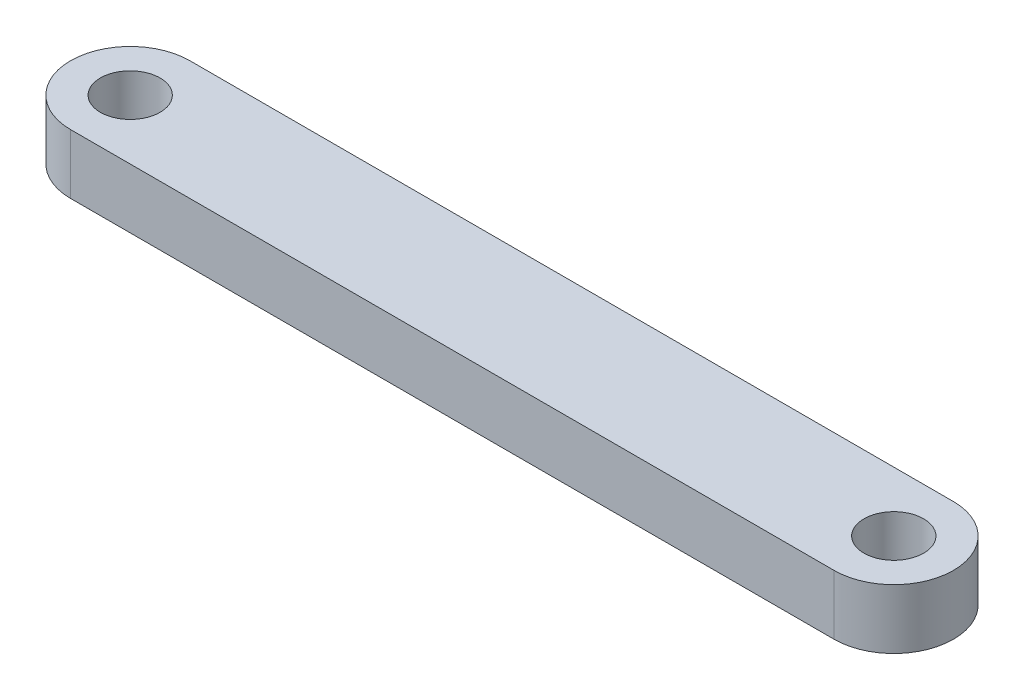
ISO-10303-21;
HEADER;
FILE_DESCRIPTION(('STEP AP214'),'2;1');
FILE_NAME('part.step','',(''),(''),'','','');
FILE_SCHEMA(('AUTOMOTIVE_DESIGN { 1 0 10303 214 1 1 1 1 }'));
ENDSEC;
DATA;
#1=APPLICATION_CONTEXT('core data for automotive mechanical design processes');
#2=APPLICATION_PROTOCOL_DEFINITION('international standard','automotive_design',2000,#1);
#3=PRODUCT_CONTEXT('',#1,'mechanical');
#4=PRODUCT('Part','Part','',(#3));
#5=PRODUCT_RELATED_PRODUCT_CATEGORY('part','',(#4));
#6=PRODUCT_DEFINITION_FORMATION('','',#4);
#7=PRODUCT_DEFINITION_CONTEXT('part definition',#1,'design');
#8=PRODUCT_DEFINITION('design','',#6,#7);
#9=PRODUCT_DEFINITION_SHAPE('','',#8);
#10=(LENGTH_UNIT() NAMED_UNIT(*) SI_UNIT(.MILLI.,.METRE.));
#11=(NAMED_UNIT(*) PLANE_ANGLE_UNIT() SI_UNIT($,.RADIAN.));
#12=(NAMED_UNIT(*) SI_UNIT($,.STERADIAN.) SOLID_ANGLE_UNIT());
#13=UNCERTAINTY_MEASURE_WITH_UNIT(LENGTH_MEASURE(1.E-05),#10,'distance_accuracy_value','');
#14=(GEOMETRIC_REPRESENTATION_CONTEXT(3) GLOBAL_UNCERTAINTY_ASSIGNED_CONTEXT((#13)) GLOBAL_UNIT_ASSIGNED_CONTEXT((#10,
#11,#12)) REPRESENTATION_CONTEXT('',''));
#15=CARTESIAN_POINT('',(0.,0.,0.));
#16=DIRECTION('',(0.,0.,1.));
#17=DIRECTION('',(1.,0.,0.));
#18=AXIS2_PLACEMENT_3D('',#15,#16,#17);
#19=CARTESIAN_POINT('',(-640.,50.,0.));
#20=DIRECTION('',(0.,1.,0.));
#21=DIRECTION('',(0.,0.,1.));
#22=AXIS2_PLACEMENT_3D('',#19,#20,#21);
#23=PLANE('',#22);
#24=CARTESIAN_POINT('',(-640.,50.,0.));
#25=DIRECTION('',(0.,1.,0.));
#26=DIRECTION('',(0.,0.,1.));
#27=AXIS2_PLACEMENT_3D('',#24,#25,#26);
#28=CIRCLE('',#27,50.);
#29=CARTESIAN_POINT('',(-640.,50.,50.));
#30=VERTEX_POINT('',#29);
#31=EDGE_CURVE('E117',#30,#30,#28,.T.);
#32=ORIENTED_EDGE('',*,*,#31,.F.);
#33=EDGE_LOOP('',(#32));
#34=FACE_BOUND('',#33,.T.);
#35=CARTESIAN_POINT('',(-640.,50.,0.));
#36=DIRECTION('',(0.,1.,0.));
#37=DIRECTION('',(0.,0.,1.));
#38=AXIS2_PLACEMENT_3D('',#35,#36,#37);
#39=CIRCLE('',#38,100.);
#40=CARTESIAN_POINT('',(-640.,50.,-100.));
#41=VERTEX_POINT('',#40);
#42=CARTESIAN_POINT('',(-640.,50.,100.));
#43=VERTEX_POINT('',#42);
#44=EDGE_CURVE('E96',#41,#43,#39,.T.);
#45=ORIENTED_EDGE('',*,*,#44,.T.);
#46=DIRECTION('',(1.,0.,0.));
#47=VECTOR('',#46,1.);
#48=CARTESIAN_POINT('',(-640.,50.,100.));
#49=LINE('',#48,#47);
#50=CARTESIAN_POINT('',(640.,50.,100.));
#51=VERTEX_POINT('',#50);
#52=EDGE_CURVE('E91',#43,#51,#49,.T.);
#53=ORIENTED_EDGE('',*,*,#52,.T.);
#54=CARTESIAN_POINT('',(640.,50.,0.));
#55=DIRECTION('',(0.,1.,0.));
#56=DIRECTION('',(0.,0.,1.));
#57=AXIS2_PLACEMENT_3D('',#54,#55,#56);
#58=CIRCLE('',#57,100.);
#59=CARTESIAN_POINT('',(640.,50.,-100.));
#60=VERTEX_POINT('',#59);
#61=EDGE_CURVE('E94',#51,#60,#58,.T.);
#62=ORIENTED_EDGE('',*,*,#61,.T.);
#63=DIRECTION('',(-1.,0.,0.));
#64=VECTOR('',#63,1.);
#65=CARTESIAN_POINT('',(-640.,50.,-100.));
#66=LINE('',#65,#64);
#67=EDGE_CURVE('E61',#60,#41,#66,.T.);
#68=ORIENTED_EDGE('',*,*,#67,.T.);
#69=EDGE_LOOP('',(#45,#53,#62,#68));
#70=FACE_BOUND('',#69,.T.);
#71=CARTESIAN_POINT('',(640.,50.,0.));
#72=DIRECTION('',(0.,1.,0.));
#73=DIRECTION('',(0.,0.,1.));
#74=AXIS2_PLACEMENT_3D('',#71,#72,#73);
#75=CIRCLE('',#74,50.);
#76=CARTESIAN_POINT('',(640.,50.,50.));
#77=VERTEX_POINT('',#76);
#78=EDGE_CURVE('E140',#77,#77,#75,.T.);
#79=ORIENTED_EDGE('',*,*,#78,.F.);
#80=EDGE_LOOP('',(#79));
#81=FACE_BOUND('',#80,.T.);
#82=ADVANCED_FACE('F43',(#34,#70,#81),#23,.T.);
#83=CARTESIAN_POINT('',(-640.,-50.,0.));
#84=DIRECTION('',(0.,1.,0.));
#85=DIRECTION('',(0.,0.,1.));
#86=AXIS2_PLACEMENT_3D('',#83,#84,#85);
#87=PLANE('',#86);
#88=CARTESIAN_POINT('',(-640.,-50.,0.));
#89=DIRECTION('',(0.,1.,0.));
#90=DIRECTION('',(0.,0.,1.));
#91=AXIS2_PLACEMENT_3D('',#88,#89,#90);
#92=CIRCLE('',#91,100.);
#93=CARTESIAN_POINT('',(-640.,-50.,-100.));
#94=VERTEX_POINT('',#93);
#95=CARTESIAN_POINT('',(-640.,-50.,100.));
#96=VERTEX_POINT('',#95);
#97=EDGE_CURVE('E114',#94,#96,#92,.T.);
#98=ORIENTED_EDGE('',*,*,#97,.F.);
#99=DIRECTION('',(-1.,0.,0.));
#100=VECTOR('',#99,1.);
#101=CARTESIAN_POINT('',(-640.,-50.,-100.));
#102=LINE('',#101,#100);
#103=CARTESIAN_POINT('',(640.,-50.,-100.));
#104=VERTEX_POINT('',#103);
#105=EDGE_CURVE('E84',#104,#94,#102,.T.);
#106=ORIENTED_EDGE('',*,*,#105,.F.);
#107=CARTESIAN_POINT('',(640.,-50.,0.));
#108=DIRECTION('',(0.,1.,0.));
#109=DIRECTION('',(0.,0.,1.));
#110=AXIS2_PLACEMENT_3D('',#107,#108,#109);
#111=CIRCLE('',#110,100.);
#112=CARTESIAN_POINT('',(640.,-50.,100.));
#113=VERTEX_POINT('',#112);
#114=EDGE_CURVE('E78',#113,#104,#111,.T.);
#115=ORIENTED_EDGE('',*,*,#114,.F.);
#116=DIRECTION('',(1.,0.,0.));
#117=VECTOR('',#116,1.);
#118=CARTESIAN_POINT('',(-640.,-50.,100.));
#119=LINE('',#118,#117);
#120=EDGE_CURVE('E101',#96,#113,#119,.T.);
#121=ORIENTED_EDGE('',*,*,#120,.F.);
#122=EDGE_LOOP('',(#98,#106,#115,#121));
#123=FACE_BOUND('',#122,.T.);
#124=CARTESIAN_POINT('',(-640.,-50.,0.));
#125=DIRECTION('',(0.,1.,0.));
#126=DIRECTION('',(0.,0.,1.));
#127=AXIS2_PLACEMENT_3D('',#124,#125,#126);
#128=CIRCLE('',#127,50.);
#129=CARTESIAN_POINT('',(-640.,-50.,50.));
#130=VERTEX_POINT('',#129);
#131=EDGE_CURVE('E137',#130,#130,#128,.T.);
#132=ORIENTED_EDGE('',*,*,#131,.T.);
#133=EDGE_LOOP('',(#132));
#134=FACE_BOUND('',#133,.T.);
#135=CARTESIAN_POINT('',(640.,-50.,0.));
#136=DIRECTION('',(0.,1.,0.));
#137=DIRECTION('',(0.,0.,1.));
#138=AXIS2_PLACEMENT_3D('',#135,#136,#137);
#139=CIRCLE('',#138,50.);
#140=CARTESIAN_POINT('',(640.,-50.,50.));
#141=VERTEX_POINT('',#140);
#142=EDGE_CURVE('E143',#141,#141,#139,.T.);
#143=ORIENTED_EDGE('',*,*,#142,.T.);
#144=EDGE_LOOP('',(#143));
#145=FACE_BOUND('',#144,.T.);
#146=ADVANCED_FACE('F131',(#123,#134,#145),#87,.F.);
#147=CARTESIAN_POINT('',(-640.,50.,0.));
#148=DIRECTION('',(0.,-1.,0.));
#149=DIRECTION('',(0.,0.,-1.));
#150=AXIS2_PLACEMENT_3D('',#147,#148,#149);
#151=CYLINDRICAL_SURFACE('',#150,100.);
#152=ORIENTED_EDGE('',*,*,#97,.T.);
#153=DIRECTION('',(0.,-1.,0.));
#154=VECTOR('',#153,1.);
#155=CARTESIAN_POINT('',(-640.,50.,100.));
#156=LINE('',#155,#154);
#157=EDGE_CURVE('E11',#43,#96,#156,.T.);
#158=ORIENTED_EDGE('',*,*,#157,.F.);
#159=ORIENTED_EDGE('',*,*,#44,.F.);
#160=DIRECTION('',(0.,-1.,0.));
#161=VECTOR('',#160,1.);
#162=CARTESIAN_POINT('',(-640.,50.,-100.));
#163=LINE('',#162,#161);
#164=EDGE_CURVE('E110',#41,#94,#163,.T.);
#165=ORIENTED_EDGE('',*,*,#164,.T.);
#166=EDGE_LOOP('',(#152,#158,#159,#165));
#167=FACE_BOUND('',#166,.T.);
#168=ADVANCED_FACE('F45',(#167),#151,.T.);
#169=CARTESIAN_POINT('',(-640.,50.,100.));
#170=DIRECTION('',(0.,0.,-1.));
#171=DIRECTION('',(-1.,0.,0.));
#172=AXIS2_PLACEMENT_3D('',#169,#170,#171);
#173=PLANE('',#172);
#174=ORIENTED_EDGE('',*,*,#120,.T.);
#175=DIRECTION('',(0.,-1.,0.));
#176=VECTOR('',#175,1.);
#177=CARTESIAN_POINT('',(640.,50.,100.));
#178=LINE('',#177,#176);
#179=EDGE_CURVE('E53',#51,#113,#178,.T.);
#180=ORIENTED_EDGE('',*,*,#179,.F.);
#181=ORIENTED_EDGE('',*,*,#52,.F.);
#182=ORIENTED_EDGE('',*,*,#157,.T.);
#183=EDGE_LOOP('',(#174,#180,#181,#182));
#184=FACE_BOUND('',#183,.T.);
#185=ADVANCED_FACE('F100',(#184),#173,.F.);
#186=CARTESIAN_POINT('',(640.,50.,0.));
#187=DIRECTION('',(0.,-1.,0.));
#188=DIRECTION('',(0.,0.,-1.));
#189=AXIS2_PLACEMENT_3D('',#186,#187,#188);
#190=CYLINDRICAL_SURFACE('',#189,100.);
#191=ORIENTED_EDGE('',*,*,#114,.T.);
#192=DIRECTION('',(0.,-1.,0.));
#193=VECTOR('',#192,1.);
#194=CARTESIAN_POINT('',(640.,50.,-100.));
#195=LINE('',#194,#193);
#196=EDGE_CURVE('E103',#60,#104,#195,.T.);
#197=ORIENTED_EDGE('',*,*,#196,.F.);
#198=ORIENTED_EDGE('',*,*,#61,.F.);
#199=ORIENTED_EDGE('',*,*,#179,.T.);
#200=EDGE_LOOP('',(#191,#197,#198,#199));
#201=FACE_BOUND('',#200,.T.);
#202=ADVANCED_FACE('F104',(#201),#190,.T.);
#203=CARTESIAN_POINT('',(-640.,50.,-100.));
#204=DIRECTION('',(0.,0.,1.));
#205=DIRECTION('',(1.,0.,0.));
#206=AXIS2_PLACEMENT_3D('',#203,#204,#205);
#207=PLANE('',#206);
#208=ORIENTED_EDGE('',*,*,#105,.T.);
#209=ORIENTED_EDGE('',*,*,#164,.F.);
#210=ORIENTED_EDGE('',*,*,#67,.F.);
#211=ORIENTED_EDGE('',*,*,#196,.T.);
#212=EDGE_LOOP('',(#208,#209,#210,#211));
#213=FACE_BOUND('',#212,.T.);
#214=ADVANCED_FACE('F128',(#213),#207,.F.);
#215=CARTESIAN_POINT('',(-640.,50.,0.));
#216=DIRECTION('',(0.,-1.,0.));
#217=DIRECTION('',(0.,0.,-1.));
#218=AXIS2_PLACEMENT_3D('',#215,#216,#217);
#219=CYLINDRICAL_SURFACE('',#218,50.);
#220=ORIENTED_EDGE('',*,*,#31,.T.);
#221=EDGE_LOOP('',(#220));
#222=FACE_BOUND('',#221,.T.);
#223=ORIENTED_EDGE('',*,*,#131,.F.);
#224=EDGE_LOOP('',(#223));
#225=FACE_BOUND('',#224,.T.);
#226=ADVANCED_FACE('F161',(#222,#225),#219,.F.);
#227=CARTESIAN_POINT('',(640.,50.,0.));
#228=DIRECTION('',(0.,-1.,0.));
#229=DIRECTION('',(0.,0.,-1.));
#230=AXIS2_PLACEMENT_3D('',#227,#228,#229);
#231=CYLINDRICAL_SURFACE('',#230,50.);
#232=ORIENTED_EDGE('',*,*,#78,.T.);
#233=EDGE_LOOP('',(#232));
#234=FACE_BOUND('',#233,.T.);
#235=ORIENTED_EDGE('',*,*,#142,.F.);
#236=EDGE_LOOP('',(#235));
#237=FACE_BOUND('',#236,.T.);
#238=ADVANCED_FACE('F150',(#234,#237),#231,.F.);
#239=CLOSED_SHELL('',(#82,#146,#168,#185,#202,#214,#226,#238));
#240=MANIFOLD_SOLID_BREP('B2',#239);
#241=ADVANCED_BREP_SHAPE_REPRESENTATION('',(#18,#240),#14);
#242=SHAPE_DEFINITION_REPRESENTATION(#9,#241);
ENDSEC;
END-ISO-10303-21;
